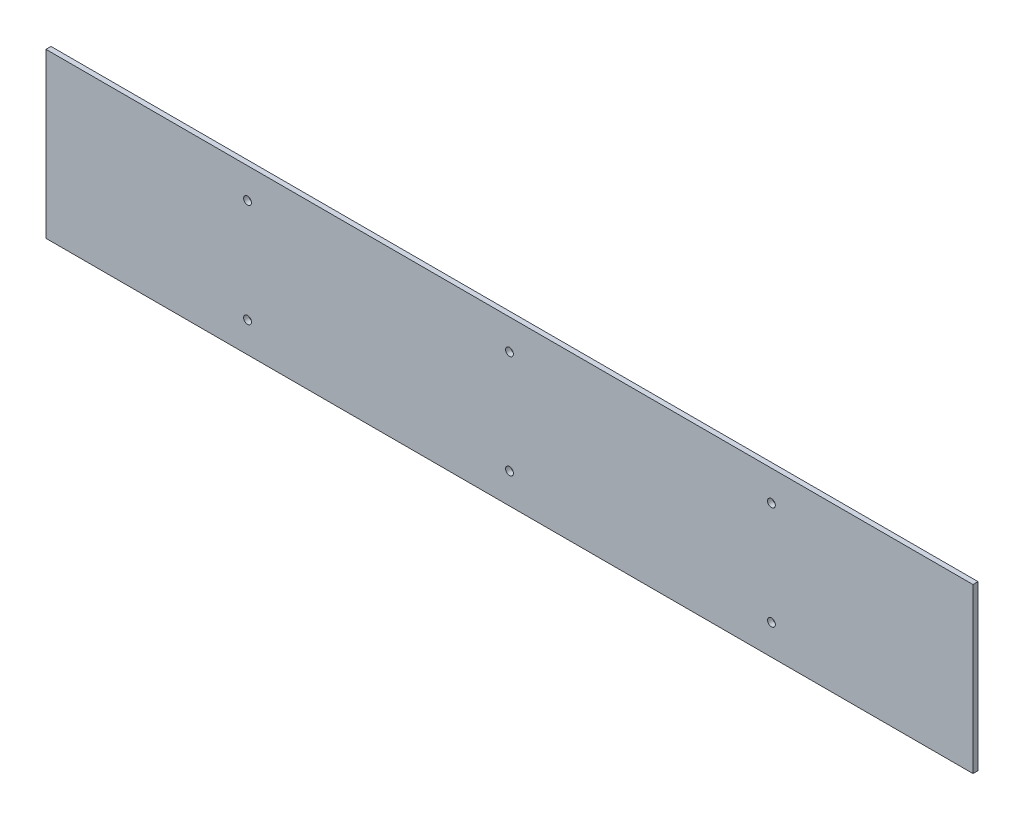
ISO-10303-21;
HEADER;
FILE_DESCRIPTION(('STEP AP214'),'2;1');
FILE_NAME('part.step','',(''),(''),'','','');
FILE_SCHEMA(('AUTOMOTIVE_DESIGN { 1 0 10303 214 1 1 1 1 }'));
ENDSEC;
DATA;
#1=APPLICATION_CONTEXT('core data for automotive mechanical design processes');
#2=APPLICATION_PROTOCOL_DEFINITION('international standard','automotive_design',2000,#1);
#3=PRODUCT_CONTEXT('',#1,'mechanical');
#4=PRODUCT('Part','Part','',(#3));
#5=PRODUCT_RELATED_PRODUCT_CATEGORY('part','',(#4));
#6=PRODUCT_DEFINITION_FORMATION('','',#4);
#7=PRODUCT_DEFINITION_CONTEXT('part definition',#1,'design');
#8=PRODUCT_DEFINITION('design','',#6,#7);
#9=PRODUCT_DEFINITION_SHAPE('','',#8);
#10=(LENGTH_UNIT() NAMED_UNIT(*) SI_UNIT(.MILLI.,.METRE.));
#11=(NAMED_UNIT(*) PLANE_ANGLE_UNIT() SI_UNIT($,.RADIAN.));
#12=(NAMED_UNIT(*) SI_UNIT($,.STERADIAN.) SOLID_ANGLE_UNIT());
#13=UNCERTAINTY_MEASURE_WITH_UNIT(LENGTH_MEASURE(1.E-05),#10,'distance_accuracy_value','');
#14=(GEOMETRIC_REPRESENTATION_CONTEXT(3) GLOBAL_UNCERTAINTY_ASSIGNED_CONTEXT((#13)) GLOBAL_UNIT_ASSIGNED_CONTEXT((#10,
#11,#12)) REPRESENTATION_CONTEXT('',''));
#15=CARTESIAN_POINT('',(0.,0.,0.));
#16=DIRECTION('',(0.,0.,1.));
#17=DIRECTION('',(1.,0.,0.));
#18=AXIS2_PLACEMENT_3D('',#15,#16,#17);
#19=CARTESIAN_POINT('',(0.,0.,0.));
#20=DIRECTION('',(0.,0.,-1.));
#21=DIRECTION('',(-1.,0.,0.));
#22=AXIS2_PLACEMENT_3D('',#19,#20,#21);
#23=PLANE('',#22);
#24=CARTESIAN_POINT('',(127.,19.05,0.));
#25=DIRECTION('',(0.,0.,1.));
#26=DIRECTION('',(1.,0.,0.));
#27=AXIS2_PLACEMENT_3D('',#24,#25,#26);
#28=CIRCLE('',#27,2.45745);
#29=CARTESIAN_POINT('',(129.45745,19.05,0.));
#30=VERTEX_POINT('',#29);
#31=EDGE_CURVE('E142',#30,#30,#28,.T.);
#32=ORIENTED_EDGE('',*,*,#31,.T.);
#33=EDGE_LOOP('',(#32));
#34=FACE_BOUND('',#33,.T.);
#35=CARTESIAN_POINT('',(292.1,19.0499999999999,0.));
#36=DIRECTION('',(0.,0.,1.));
#37=DIRECTION('',(1.,0.,0.));
#38=AXIS2_PLACEMENT_3D('',#35,#36,#37);
#39=CIRCLE('',#38,2.45744999999997);
#40=CARTESIAN_POINT('',(294.55745,19.0499999999999,0.));
#41=VERTEX_POINT('',#40);
#42=EDGE_CURVE('E136',#41,#41,#39,.T.);
#43=ORIENTED_EDGE('',*,*,#42,.T.);
#44=EDGE_LOOP('',(#43));
#45=FACE_BOUND('',#44,.T.);
#46=DIRECTION('',(0.,-1.,0.));
#47=VECTOR('',#46,1.);
#48=CARTESIAN_POINT('',(0.,0.,0.));
#49=LINE('',#48,#47);
#50=CARTESIAN_POINT('',(0.,103.1875,0.));
#51=VERTEX_POINT('',#50);
#52=CARTESIAN_POINT('',(0.,0.,0.));
#53=VERTEX_POINT('',#52);
#54=EDGE_CURVE('E99',#51,#53,#49,.T.);
#55=ORIENTED_EDGE('',*,*,#54,.F.);
#56=DIRECTION('',(-1.,0.,0.));
#57=VECTOR('',#56,1.);
#58=CARTESIAN_POINT('',(0.,103.1875,0.));
#59=LINE('',#58,#57);
#60=CARTESIAN_POINT('',(584.2,103.1875,0.));
#61=VERTEX_POINT('',#60);
#62=EDGE_CURVE('E75',#61,#51,#59,.T.);
#63=ORIENTED_EDGE('',*,*,#62,.F.);
#64=DIRECTION('',(0.,1.,0.));
#65=VECTOR('',#64,1.);
#66=CARTESIAN_POINT('',(584.2,0.,0.));
#67=LINE('',#66,#65);
#68=CARTESIAN_POINT('',(584.2,0.,0.));
#69=VERTEX_POINT('',#68);
#70=EDGE_CURVE('E69',#69,#61,#67,.T.);
#71=ORIENTED_EDGE('',*,*,#70,.F.);
#72=DIRECTION('',(1.,0.,0.));
#73=VECTOR('',#72,1.);
#74=CARTESIAN_POINT('',(0.,0.,0.));
#75=LINE('',#74,#73);
#76=EDGE_CURVE('E91',#53,#69,#75,.T.);
#77=ORIENTED_EDGE('',*,*,#76,.F.);
#78=EDGE_LOOP('',(#55,#63,#71,#77));
#79=FACE_BOUND('',#78,.T.);
#80=CARTESIAN_POINT('',(457.2,84.1375000000001,0.));
#81=DIRECTION('',(0.,0.,1.));
#82=DIRECTION('',(1.,0.,0.));
#83=AXIS2_PLACEMENT_3D('',#80,#81,#82);
#84=CIRCLE('',#83,2.45744999999997);
#85=CARTESIAN_POINT('',(459.65745,84.1375000000001,0.));
#86=VERTEX_POINT('',#85);
#87=EDGE_CURVE('E102',#86,#86,#84,.T.);
#88=ORIENTED_EDGE('',*,*,#87,.T.);
#89=EDGE_LOOP('',(#88));
#90=FACE_BOUND('',#89,.T.);
#91=CARTESIAN_POINT('',(292.1,84.1375000000001,0.));
#92=DIRECTION('',(0.,0.,1.));
#93=DIRECTION('',(1.,0.,0.));
#94=AXIS2_PLACEMENT_3D('',#91,#92,#93);
#95=CIRCLE('',#94,2.45744999999997);
#96=CARTESIAN_POINT('',(294.55745,84.1375000000001,0.));
#97=VERTEX_POINT('',#96);
#98=EDGE_CURVE('E118',#97,#97,#95,.T.);
#99=ORIENTED_EDGE('',*,*,#98,.T.);
#100=EDGE_LOOP('',(#99));
#101=FACE_BOUND('',#100,.T.);
#102=CARTESIAN_POINT('',(127.,84.1375,0.));
#103=DIRECTION('',(0.,0.,1.));
#104=DIRECTION('',(1.,0.,0.));
#105=AXIS2_PLACEMENT_3D('',#102,#103,#104);
#106=CIRCLE('',#105,2.45745);
#107=CARTESIAN_POINT('',(129.45745,84.1375,0.));
#108=VERTEX_POINT('',#107);
#109=EDGE_CURVE('E124',#108,#108,#106,.T.);
#110=ORIENTED_EDGE('',*,*,#109,.T.);
#111=EDGE_LOOP('',(#110));
#112=FACE_BOUND('',#111,.T.);
#113=CARTESIAN_POINT('',(457.2,19.0499999999999,0.));
#114=DIRECTION('',(0.,0.,1.));
#115=DIRECTION('',(1.,0.,0.));
#116=AXIS2_PLACEMENT_3D('',#113,#114,#115);
#117=CIRCLE('',#116,2.45744999999997);
#118=CARTESIAN_POINT('',(459.65745,19.0499999999999,0.));
#119=VERTEX_POINT('',#118);
#120=EDGE_CURVE('E130',#119,#119,#117,.T.);
#121=ORIENTED_EDGE('',*,*,#120,.T.);
#122=EDGE_LOOP('',(#121));
#123=FACE_BOUND('',#122,.T.);
#124=ADVANCED_FACE('F35',(#34,#45,#79,#90,#101,#112,#123),#23,.T.);
#125=CARTESIAN_POINT('',(0.,0.,3.175));
#126=DIRECTION('',(1.,0.,0.));
#127=DIRECTION('',(0.,0.,-1.));
#128=AXIS2_PLACEMENT_3D('',#125,#126,#127);
#129=PLANE('',#128);
#130=ORIENTED_EDGE('',*,*,#54,.T.);
#131=DIRECTION('',(0.,0.,-1.));
#132=VECTOR('',#131,1.);
#133=CARTESIAN_POINT('',(0.,0.,3.175));
#134=LINE('',#133,#132);
#135=CARTESIAN_POINT('',(0.,0.,3.175));
#136=VERTEX_POINT('',#135);
#137=EDGE_CURVE('E11',#136,#53,#134,.T.);
#138=ORIENTED_EDGE('',*,*,#137,.F.);
#139=DIRECTION('',(0.,-1.,0.));
#140=VECTOR('',#139,1.);
#141=CARTESIAN_POINT('',(0.,0.,3.175));
#142=LINE('',#141,#140);
#143=CARTESIAN_POINT('',(0.,103.1875,3.175));
#144=VERTEX_POINT('',#143);
#145=EDGE_CURVE('E87',#144,#136,#142,.T.);
#146=ORIENTED_EDGE('',*,*,#145,.F.);
#147=DIRECTION('',(0.,0.,-1.));
#148=VECTOR('',#147,1.);
#149=CARTESIAN_POINT('',(0.,103.1875,3.175));
#150=LINE('',#149,#148);
#151=EDGE_CURVE('E95',#144,#51,#150,.T.);
#152=ORIENTED_EDGE('',*,*,#151,.T.);
#153=EDGE_LOOP('',(#130,#138,#146,#152));
#154=FACE_BOUND('',#153,.T.);
#155=ADVANCED_FACE('F37',(#154),#129,.F.);
#156=CARTESIAN_POINT('',(0.,0.,3.175));
#157=DIRECTION('',(0.,1.,0.));
#158=DIRECTION('',(0.,0.,1.));
#159=AXIS2_PLACEMENT_3D('',#156,#157,#158);
#160=PLANE('',#159);
#161=ORIENTED_EDGE('',*,*,#76,.T.);
#162=DIRECTION('',(0.,0.,-1.));
#163=VECTOR('',#162,1.);
#164=CARTESIAN_POINT('',(584.2,0.,3.175));
#165=LINE('',#164,#163);
#166=CARTESIAN_POINT('',(584.2,0.,3.175));
#167=VERTEX_POINT('',#166);
#168=EDGE_CURVE('E44',#167,#69,#165,.T.);
#169=ORIENTED_EDGE('',*,*,#168,.F.);
#170=DIRECTION('',(1.,0.,0.));
#171=VECTOR('',#170,1.);
#172=CARTESIAN_POINT('',(0.,0.,3.175));
#173=LINE('',#172,#171);
#174=EDGE_CURVE('E82',#136,#167,#173,.T.);
#175=ORIENTED_EDGE('',*,*,#174,.F.);
#176=ORIENTED_EDGE('',*,*,#137,.T.);
#177=EDGE_LOOP('',(#161,#169,#175,#176));
#178=FACE_BOUND('',#177,.T.);
#179=ADVANCED_FACE('F90',(#178),#160,.F.);
#180=CARTESIAN_POINT('',(584.2,0.,3.175));
#181=DIRECTION('',(-1.,0.,0.));
#182=DIRECTION('',(0.,0.,1.));
#183=AXIS2_PLACEMENT_3D('',#180,#181,#182);
#184=PLANE('',#183);
#185=ORIENTED_EDGE('',*,*,#70,.T.);
#186=DIRECTION('',(0.,0.,-1.));
#187=VECTOR('',#186,1.);
#188=CARTESIAN_POINT('',(584.2,103.1875,3.175));
#189=LINE('',#188,#187);
#190=CARTESIAN_POINT('',(584.2,103.1875,3.175));
#191=VERTEX_POINT('',#190);
#192=EDGE_CURVE('E92',#191,#61,#189,.T.);
#193=ORIENTED_EDGE('',*,*,#192,.F.);
#194=DIRECTION('',(0.,1.,0.));
#195=VECTOR('',#194,1.);
#196=CARTESIAN_POINT('',(584.2,0.,3.175));
#197=LINE('',#196,#195);
#198=EDGE_CURVE('E85',#167,#191,#197,.T.);
#199=ORIENTED_EDGE('',*,*,#198,.F.);
#200=ORIENTED_EDGE('',*,*,#168,.T.);
#201=EDGE_LOOP('',(#185,#193,#199,#200));
#202=FACE_BOUND('',#201,.T.);
#203=ADVANCED_FACE('F93',(#202),#184,.F.);
#204=CARTESIAN_POINT('',(0.,103.1875,3.175));
#205=DIRECTION('',(0.,-1.,0.));
#206=DIRECTION('',(0.,0.,-1.));
#207=AXIS2_PLACEMENT_3D('',#204,#205,#206);
#208=PLANE('',#207);
#209=ORIENTED_EDGE('',*,*,#62,.T.);
#210=ORIENTED_EDGE('',*,*,#151,.F.);
#211=DIRECTION('',(-1.,0.,0.));
#212=VECTOR('',#211,1.);
#213=CARTESIAN_POINT('',(0.,103.1875,3.175));
#214=LINE('',#213,#212);
#215=EDGE_CURVE('E52',#191,#144,#214,.T.);
#216=ORIENTED_EDGE('',*,*,#215,.F.);
#217=ORIENTED_EDGE('',*,*,#192,.T.);
#218=EDGE_LOOP('',(#209,#210,#216,#217));
#219=FACE_BOUND('',#218,.T.);
#220=ADVANCED_FACE('F107',(#219),#208,.F.);
#221=CARTESIAN_POINT('',(0.,0.,3.175));
#222=DIRECTION('',(0.,0.,-1.));
#223=DIRECTION('',(-1.,0.,0.));
#224=AXIS2_PLACEMENT_3D('',#221,#222,#223);
#225=PLANE('',#224);
#226=CARTESIAN_POINT('',(127.,19.05,3.175));
#227=DIRECTION('',(0.,0.,1.));
#228=DIRECTION('',(1.,0.,0.));
#229=AXIS2_PLACEMENT_3D('',#226,#227,#228);
#230=CIRCLE('',#229,2.45745);
#231=CARTESIAN_POINT('',(129.45745,19.05,3.175));
#232=VERTEX_POINT('',#231);
#233=EDGE_CURVE('E145',#232,#232,#230,.T.);
#234=ORIENTED_EDGE('',*,*,#233,.F.);
#235=EDGE_LOOP('',(#234));
#236=FACE_BOUND('',#235,.T.);
#237=CARTESIAN_POINT('',(292.1,19.0499999999999,3.175));
#238=DIRECTION('',(0.,0.,1.));
#239=DIRECTION('',(1.,0.,0.));
#240=AXIS2_PLACEMENT_3D('',#237,#238,#239);
#241=CIRCLE('',#240,2.45744999999997);
#242=CARTESIAN_POINT('',(294.55745,19.0499999999999,3.175));
#243=VERTEX_POINT('',#242);
#244=EDGE_CURVE('E139',#243,#243,#241,.T.);
#245=ORIENTED_EDGE('',*,*,#244,.F.);
#246=EDGE_LOOP('',(#245));
#247=FACE_BOUND('',#246,.T.);
#248=CARTESIAN_POINT('',(457.2,19.0499999999999,3.175));
#249=DIRECTION('',(0.,0.,1.));
#250=DIRECTION('',(1.,0.,0.));
#251=AXIS2_PLACEMENT_3D('',#248,#249,#250);
#252=CIRCLE('',#251,2.45744999999997);
#253=CARTESIAN_POINT('',(459.65745,19.0499999999999,3.175));
#254=VERTEX_POINT('',#253);
#255=EDGE_CURVE('E133',#254,#254,#252,.T.);
#256=ORIENTED_EDGE('',*,*,#255,.F.);
#257=EDGE_LOOP('',(#256));
#258=FACE_BOUND('',#257,.T.);
#259=CARTESIAN_POINT('',(127.,84.1375,3.175));
#260=DIRECTION('',(0.,0.,1.));
#261=DIRECTION('',(1.,0.,0.));
#262=AXIS2_PLACEMENT_3D('',#259,#260,#261);
#263=CIRCLE('',#262,2.45745);
#264=CARTESIAN_POINT('',(129.45745,84.1375,3.175));
#265=VERTEX_POINT('',#264);
#266=EDGE_CURVE('E127',#265,#265,#263,.T.);
#267=ORIENTED_EDGE('',*,*,#266,.F.);
#268=EDGE_LOOP('',(#267));
#269=FACE_BOUND('',#268,.T.);
#270=CARTESIAN_POINT('',(292.1,84.1375000000001,3.175));
#271=DIRECTION('',(0.,0.,1.));
#272=DIRECTION('',(1.,0.,0.));
#273=AXIS2_PLACEMENT_3D('',#270,#271,#272);
#274=CIRCLE('',#273,2.45744999999997);
#275=CARTESIAN_POINT('',(294.55745,84.1375000000001,3.175));
#276=VERTEX_POINT('',#275);
#277=EDGE_CURVE('E121',#276,#276,#274,.T.);
#278=ORIENTED_EDGE('',*,*,#277,.F.);
#279=EDGE_LOOP('',(#278));
#280=FACE_BOUND('',#279,.T.);
#281=CARTESIAN_POINT('',(457.2,84.1375000000001,3.175));
#282=DIRECTION('',(0.,0.,1.));
#283=DIRECTION('',(1.,0.,0.));
#284=AXIS2_PLACEMENT_3D('',#281,#282,#283);
#285=CIRCLE('',#284,2.45744999999997);
#286=CARTESIAN_POINT('',(459.65745,84.1375000000001,3.175));
#287=VERTEX_POINT('',#286);
#288=EDGE_CURVE('E115',#287,#287,#285,.T.);
#289=ORIENTED_EDGE('',*,*,#288,.F.);
#290=EDGE_LOOP('',(#289));
#291=FACE_BOUND('',#290,.T.);
#292=ORIENTED_EDGE('',*,*,#145,.T.);
#293=ORIENTED_EDGE('',*,*,#174,.T.);
#294=ORIENTED_EDGE('',*,*,#198,.T.);
#295=ORIENTED_EDGE('',*,*,#215,.T.);
#296=EDGE_LOOP('',(#292,#293,#294,#295));
#297=FACE_BOUND('',#296,.T.);
#298=ADVANCED_FACE('F83',(#236,#247,#258,#269,#280,#291,#297),#225,.F.);
#299=CARTESIAN_POINT('',(457.2,84.1375000000001,3.175));
#300=DIRECTION('',(0.,0.,1.));
#301=DIRECTION('',(1.,0.,0.));
#302=AXIS2_PLACEMENT_3D('',#299,#300,#301);
#303=CYLINDRICAL_SURFACE('',#302,2.45744999999997);
#304=ORIENTED_EDGE('',*,*,#87,.F.);
#305=EDGE_LOOP('',(#304));
#306=FACE_BOUND('',#305,.T.);
#307=ORIENTED_EDGE('',*,*,#288,.T.);
#308=EDGE_LOOP('',(#307));
#309=FACE_BOUND('',#308,.T.);
#310=ADVANCED_FACE('F153',(#306,#309),#303,.F.);
#311=CARTESIAN_POINT('',(292.1,84.1375000000001,3.175));
#312=DIRECTION('',(0.,0.,1.));
#313=DIRECTION('',(1.,0.,0.));
#314=AXIS2_PLACEMENT_3D('',#311,#312,#313);
#315=CYLINDRICAL_SURFACE('',#314,2.45744999999997);
#316=ORIENTED_EDGE('',*,*,#98,.F.);
#317=EDGE_LOOP('',(#316));
#318=FACE_BOUND('',#317,.T.);
#319=ORIENTED_EDGE('',*,*,#277,.T.);
#320=EDGE_LOOP('',(#319));
#321=FACE_BOUND('',#320,.T.);
#322=ADVANCED_FACE('F166',(#318,#321),#315,.F.);
#323=CARTESIAN_POINT('',(127.,84.1375,3.175));
#324=DIRECTION('',(0.,0.,1.));
#325=DIRECTION('',(1.,0.,0.));
#326=AXIS2_PLACEMENT_3D('',#323,#324,#325);
#327=CYLINDRICAL_SURFACE('',#326,2.45745);
#328=ORIENTED_EDGE('',*,*,#109,.F.);
#329=EDGE_LOOP('',(#328));
#330=FACE_BOUND('',#329,.T.);
#331=ORIENTED_EDGE('',*,*,#266,.T.);
#332=EDGE_LOOP('',(#331));
#333=FACE_BOUND('',#332,.T.);
#334=ADVANCED_FACE('F172',(#330,#333),#327,.F.);
#335=CARTESIAN_POINT('',(457.2,19.0499999999999,3.175));
#336=DIRECTION('',(0.,0.,1.));
#337=DIRECTION('',(1.,0.,0.));
#338=AXIS2_PLACEMENT_3D('',#335,#336,#337);
#339=CYLINDRICAL_SURFACE('',#338,2.45744999999997);
#340=ORIENTED_EDGE('',*,*,#120,.F.);
#341=EDGE_LOOP('',(#340));
#342=FACE_BOUND('',#341,.T.);
#343=ORIENTED_EDGE('',*,*,#255,.T.);
#344=EDGE_LOOP('',(#343));
#345=FACE_BOUND('',#344,.T.);
#346=ADVANCED_FACE('F213',(#342,#345),#339,.F.);
#347=CARTESIAN_POINT('',(292.1,19.0499999999999,3.175));
#348=DIRECTION('',(0.,0.,1.));
#349=DIRECTION('',(1.,0.,0.));
#350=AXIS2_PLACEMENT_3D('',#347,#348,#349);
#351=CYLINDRICAL_SURFACE('',#350,2.45744999999997);
#352=ORIENTED_EDGE('',*,*,#42,.F.);
#353=EDGE_LOOP('',(#352));
#354=FACE_BOUND('',#353,.T.);
#355=ORIENTED_EDGE('',*,*,#244,.T.);
#356=EDGE_LOOP('',(#355));
#357=FACE_BOUND('',#356,.T.);
#358=ADVANCED_FACE('F218',(#354,#357),#351,.F.);
#359=CARTESIAN_POINT('',(127.,19.05,3.175));
#360=DIRECTION('',(0.,0.,1.));
#361=DIRECTION('',(1.,0.,0.));
#362=AXIS2_PLACEMENT_3D('',#359,#360,#361);
#363=CYLINDRICAL_SURFACE('',#362,2.45745);
#364=ORIENTED_EDGE('',*,*,#31,.F.);
#365=EDGE_LOOP('',(#364));
#366=FACE_BOUND('',#365,.T.);
#367=ORIENTED_EDGE('',*,*,#233,.T.);
#368=EDGE_LOOP('',(#367));
#369=FACE_BOUND('',#368,.T.);
#370=ADVANCED_FACE('F149',(#366,#369),#363,.F.);
#371=CLOSED_SHELL('',(#124,#155,#179,#203,#220,#298,#310,#322,#334,#346,#358,#370));
#372=MANIFOLD_SOLID_BREP('B2',#371);
#373=ADVANCED_BREP_SHAPE_REPRESENTATION('',(#18,#372),#14);
#374=SHAPE_DEFINITION_REPRESENTATION(#9,#373);
ENDSEC;
END-ISO-10303-21;
